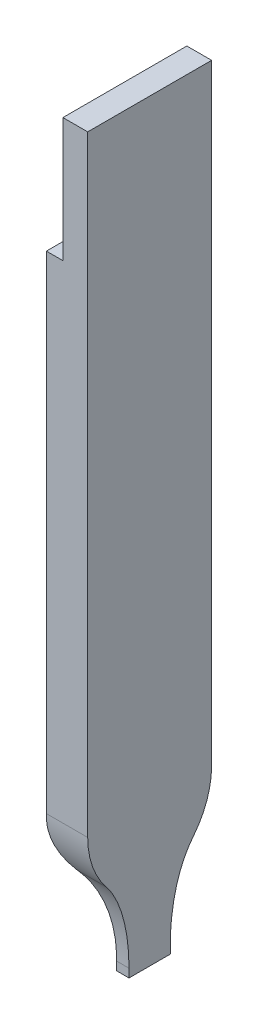
ISO-10303-21;
HEADER;
FILE_DESCRIPTION(('STEP AP214'),'2;1');
FILE_NAME('part.step','',(''),(''),'','','');
FILE_SCHEMA(('AUTOMOTIVE_DESIGN { 1 0 10303 214 1 1 1 1 }'));
ENDSEC;
DATA;
#1=APPLICATION_CONTEXT('core data for automotive mechanical design processes');
#2=APPLICATION_PROTOCOL_DEFINITION('international standard','automotive_design',2000,#1);
#3=PRODUCT_CONTEXT('',#1,'mechanical');
#4=PRODUCT('Part','Part','',(#3));
#5=PRODUCT_RELATED_PRODUCT_CATEGORY('part','',(#4));
#6=PRODUCT_DEFINITION_FORMATION('','',#4);
#7=PRODUCT_DEFINITION_CONTEXT('part definition',#1,'design');
#8=PRODUCT_DEFINITION('design','',#6,#7);
#9=PRODUCT_DEFINITION_SHAPE('','',#8);
#10=(LENGTH_UNIT() NAMED_UNIT(*) SI_UNIT(.MILLI.,.METRE.));
#11=(NAMED_UNIT(*) PLANE_ANGLE_UNIT() SI_UNIT($,.RADIAN.));
#12=(NAMED_UNIT(*) SI_UNIT($,.STERADIAN.) SOLID_ANGLE_UNIT());
#13=UNCERTAINTY_MEASURE_WITH_UNIT(LENGTH_MEASURE(1.E-05),#10,'distance_accuracy_value','');
#14=(GEOMETRIC_REPRESENTATION_CONTEXT(3) GLOBAL_UNCERTAINTY_ASSIGNED_CONTEXT((#13)) GLOBAL_UNIT_ASSIGNED_CONTEXT((#10,
#11,#12)) REPRESENTATION_CONTEXT('',''));
#15=CARTESIAN_POINT('',(0.,0.,0.));
#16=DIRECTION('',(0.,0.,1.));
#17=DIRECTION('',(1.,0.,0.));
#18=AXIS2_PLACEMENT_3D('',#15,#16,#17);
#19=CARTESIAN_POINT('',(-1.79362745098041,0.,15.));
#20=DIRECTION('',(1.,0.,0.));
#21=DIRECTION('',(0.,1.,0.));
#22=AXIS2_PLACEMENT_3D('',#19,#20,#21);
#23=PLANE('',#22);
#24=CARTESIAN_POINT('',(-1.79362745098041,-29.2048639705882,0.));
#25=CARTESIAN_POINT('',(-1.79362745098041,-31.3463143367082,4.99999999999999));
#26=CARTESIAN_POINT('',(-1.79362745098041,-40.879194786528,5.));
#27=(BOUNDED_CURVE() B_SPLINE_CURVE(2,(#24,#25,#26),.UNSPECIFIED.,.F.,
.F.) B_SPLINE_CURVE_WITH_KNOTS((3,3),(0.,1.),
.UNSPECIFIED.) CURVE() GEOMETRIC_REPRESENTATION_ITEM() RATIONAL_B_SPLINE_CURVE((1.,
0.834775654712563,1.)) REPRESENTATION_ITEM(''));
#28=CARTESIAN_POINT('',(-1.7936274509804,-40.879194786528,5.));
#29=VERTEX_POINT('',#28);
#30=CARTESIAN_POINT('',(-1.79362745098041,-30.965964483234,2.22997638980707));
#31=VERTEX_POINT('',#30);
#32=EDGE_CURVE('E267',#29,#31,#27,.F.);
#33=ORIENTED_EDGE('',*,*,#32,.T.);
#34=CARTESIAN_POINT('',(-1.7936274509804,-24.6712958071766,10.));
#35=DIRECTION('',(1.,0.,0.));
#36=DIRECTION('',(0.,1.,0.));
#37=AXIS2_PLACEMENT_3D('',#34,#35,#36);
#38=CIRCLE('',#37,10.);
#39=CARTESIAN_POINT('',(-1.79362745098041,-24.6712958071766,0.));
#40=VERTEX_POINT('',#39);
#41=EDGE_CURVE('E519',#31,#40,#38,.T.);
#42=ORIENTED_EDGE('',*,*,#41,.T.);
#43=DIRECTION('',(0.,-1.,0.));
#44=VECTOR('',#43,1.);
#45=CARTESIAN_POINT('',(-1.79362745098041,0.,0.));
#46=LINE('',#45,#44);
#47=CARTESIAN_POINT('',(-1.79362745098041,49.2951360294117,0.));
#48=VERTEX_POINT('',#47);
#49=EDGE_CURVE('E427',#48,#40,#46,.T.);
#50=ORIENTED_EDGE('',*,*,#49,.F.);
#51=DIRECTION('',(0.,0.,-1.));
#52=VECTOR('',#51,1.);
#53=CARTESIAN_POINT('',(-1.79362745098041,49.2951360294117,15.));
#54=LINE('',#53,#52);
#55=CARTESIAN_POINT('',(-1.79362745098041,49.2951360294117,15.));
#56=VERTEX_POINT('',#55);
#57=EDGE_CURVE('E223',#56,#48,#54,.T.);
#58=ORIENTED_EDGE('',*,*,#57,.F.);
#59=DIRECTION('',(0.,-1.,0.));
#60=VECTOR('',#59,1.);
#61=CARTESIAN_POINT('',(-1.79362745098041,0.,15.));
#62=LINE('',#61,#60);
#63=CARTESIAN_POINT('',(-1.79362745098041,-24.6712958071766,15.));
#64=VERTEX_POINT('',#63);
#65=EDGE_CURVE('E408',#56,#64,#62,.T.);
#66=ORIENTED_EDGE('',*,*,#65,.T.);
#67=CARTESIAN_POINT('',(-1.7936274509804,-24.6712958071766,5.));
#68=DIRECTION('',(1.,0.,0.));
#69=DIRECTION('',(0.,1.,0.));
#70=AXIS2_PLACEMENT_3D('',#67,#68,#69);
#71=CIRCLE('',#70,10.);
#72=CARTESIAN_POINT('',(-1.79362745098041,-30.9659731292309,12.7700347947671));
#73=VERTEX_POINT('',#72);
#74=EDGE_CURVE('E393',#64,#73,#71,.T.);
#75=ORIENTED_EDGE('',*,*,#74,.T.);
#76=CARTESIAN_POINT('',(-1.7936274509804,-40.879194786528,10.));
#77=CARTESIAN_POINT('',(-1.79362745098041,-31.3463143367082,10.));
#78=CARTESIAN_POINT('',(-1.79362745098041,-29.2048639705883,15.));
#79=(BOUNDED_CURVE() B_SPLINE_CURVE(2,(#76,#77,#78),.UNSPECIFIED.,.F.,
.F.) B_SPLINE_CURVE_WITH_KNOTS((3,3),(0.,1.),
.UNSPECIFIED.) CURVE() GEOMETRIC_REPRESENTATION_ITEM() RATIONAL_B_SPLINE_CURVE((1.,
0.834775654712562,1.)) REPRESENTATION_ITEM(''));
#80=CARTESIAN_POINT('',(-1.7936274509804,-40.879194786528,10.));
#81=VERTEX_POINT('',#80);
#82=EDGE_CURVE('E179',#73,#81,#79,.F.);
#83=ORIENTED_EDGE('',*,*,#82,.T.);
#84=DIRECTION('',(0.,-1.,0.));
#85=VECTOR('',#84,1.);
#86=CARTESIAN_POINT('',(-1.79362745098041,0.,10.));
#87=LINE('',#86,#85);
#88=CARTESIAN_POINT('',(-1.7936274509804,-41.9048639705883,10.));
#89=VERTEX_POINT('',#88);
#90=EDGE_CURVE('E172',#81,#89,#87,.T.);
#91=ORIENTED_EDGE('',*,*,#90,.T.);
#92=DIRECTION('',(0.,0.,-1.));
#93=VECTOR('',#92,1.);
#94=CARTESIAN_POINT('',(-1.7936274509804,-41.9048639705883,15.));
#95=LINE('',#94,#93);
#96=CARTESIAN_POINT('',(-1.7936274509804,-41.9048639705883,5.));
#97=VERTEX_POINT('',#96);
#98=EDGE_CURVE('E177',#89,#97,#95,.T.);
#99=ORIENTED_EDGE('',*,*,#98,.T.);
#100=DIRECTION('',(0.,-1.,0.));
#101=VECTOR('',#100,1.);
#102=CARTESIAN_POINT('',(-1.79362745098041,0.,5.));
#103=LINE('',#102,#101);
#104=EDGE_CURVE('E487',#29,#97,#103,.T.);
#105=ORIENTED_EDGE('',*,*,#104,.F.);
#106=EDGE_LOOP('',(#33,#42,#50,#58,#66,#75,#83,#91,#99,#105));
#107=FACE_BOUND('',#106,.T.);
#108=ADVANCED_FACE('F49',(#107),#23,.T.);
#109=CARTESIAN_POINT('',(-3.2936274509804,0.,15.));
#110=DIRECTION('',(1.,0.,0.));
#111=DIRECTION('',(0.,0.,-1.));
#112=AXIS2_PLACEMENT_3D('',#109,#110,#111);
#113=PLANE('',#112);
#114=DIRECTION('',(0.,-1.,0.));
#115=VECTOR('',#114,1.);
#116=CARTESIAN_POINT('',(-3.2936274509804,0.,10.));
#117=LINE('',#116,#115);
#118=CARTESIAN_POINT('',(-3.2936274509804,-40.879194786528,10.));
#119=VERTEX_POINT('',#118);
#120=CARTESIAN_POINT('',(-3.2936274509804,-41.9048639705883,10.));
#121=VERTEX_POINT('',#120);
#122=EDGE_CURVE('E190',#119,#121,#117,.T.);
#123=ORIENTED_EDGE('',*,*,#122,.F.);
#124=CARTESIAN_POINT('',(-3.2936274509804,-29.2048639705883,15.));
#125=CARTESIAN_POINT('',(-3.2936274509804,-31.3463143367082,10.));
#126=CARTESIAN_POINT('',(-3.2936274509804,-40.879194786528,10.));
#127=(BOUNDED_CURVE() B_SPLINE_CURVE(2,(#124,#125,#126),.UNSPECIFIED.,.F.,
.F.) B_SPLINE_CURVE_WITH_KNOTS((3,3),(0.,1.),
.UNSPECIFIED.) CURVE() GEOMETRIC_REPRESENTATION_ITEM() RATIONAL_B_SPLINE_CURVE((1.,
0.834775654712562,1.)) REPRESENTATION_ITEM(''));
#128=CARTESIAN_POINT('',(-3.2936274509804,-40.1154093281769,10.0062287084055));
#129=VERTEX_POINT('',#128);
#130=EDGE_CURVE('E642',#119,#129,#127,.F.);
#131=ORIENTED_EDGE('',*,*,#130,.T.);
#132=CARTESIAN_POINT('',(-3.2936274509804,-40.1154093281769,-0.750000000000001));
#133=CARTESIAN_POINT('',(-3.2936274509804,-40.1154093281769,4.75));
#134=CARTESIAN_POINT('',(-3.2936274509804,-40.1154093281769,10.25));
#135=CARTESIAN_POINT('',(-3.2936274509804,-40.1154093281769,15.75));
#136=(BOUNDED_CURVE() B_SPLINE_CURVE(3,(#132,#133,#134,#135),.UNSPECIFIED.,.F.,
.F.) B_SPLINE_CURVE_WITH_KNOTS((4,4),(-0.01575,0.00075),
.UNSPECIFIED.) CURVE() GEOMETRIC_REPRESENTATION_ITEM() RATIONAL_B_SPLINE_CURVE((1.,1.,1.,1.)) REPRESENTATION_ITEM(''));
#137=CARTESIAN_POINT('',(-3.2936274509804,-40.1154093281769,4.99418169439636));
#138=VERTEX_POINT('',#137);
#139=EDGE_CURVE('E226',#129,#138,#136,.F.);
#140=ORIENTED_EDGE('',*,*,#139,.T.);
#141=CARTESIAN_POINT('',(-3.2936274509804,-40.879194786528,5.));
#142=CARTESIAN_POINT('',(-3.2936274509804,-31.3463143367082,4.99999999999999));
#143=CARTESIAN_POINT('',(-3.2936274509804,-29.2048639705882,0.));
#144=(BOUNDED_CURVE() B_SPLINE_CURVE(2,(#141,#142,#143),.UNSPECIFIED.,.F.,
.F.) B_SPLINE_CURVE_WITH_KNOTS((3,3),(0.,1.),
.UNSPECIFIED.) CURVE() GEOMETRIC_REPRESENTATION_ITEM() RATIONAL_B_SPLINE_CURVE((1.,
0.834775654712563,1.)) REPRESENTATION_ITEM(''));
#145=CARTESIAN_POINT('',(-3.2936274509804,-40.879194786528,5.));
#146=VERTEX_POINT('',#145);
#147=EDGE_CURVE('E637',#138,#146,#144,.F.);
#148=ORIENTED_EDGE('',*,*,#147,.T.);
#149=DIRECTION('',(0.,-1.,0.));
#150=VECTOR('',#149,1.);
#151=CARTESIAN_POINT('',(-3.2936274509804,0.,5.));
#152=LINE('',#151,#150);
#153=CARTESIAN_POINT('',(-3.2936274509804,-41.9048639705883,5.));
#154=VERTEX_POINT('',#153);
#155=EDGE_CURVE('E195',#146,#154,#152,.T.);
#156=ORIENTED_EDGE('',*,*,#155,.T.);
#157=DIRECTION('',(0.,0.,-1.));
#158=VECTOR('',#157,1.);
#159=CARTESIAN_POINT('',(-3.2936274509804,-41.9048639705883,15.));
#160=LINE('',#159,#158);
#161=EDGE_CURVE('E201',#121,#154,#160,.T.);
#162=ORIENTED_EDGE('',*,*,#161,.F.);
#163=EDGE_LOOP('',(#123,#131,#140,#148,#156,#162));
#164=FACE_BOUND('',#163,.T.);
#165=ADVANCED_FACE('F235',(#164),#113,.F.);
#166=CARTESIAN_POINT('',(0.,-41.9048639705883,15.));
#167=DIRECTION('',(0.,-1.,0.));
#168=DIRECTION('',(0.,0.,-1.));
#169=AXIS2_PLACEMENT_3D('',#166,#167,#168);
#170=PLANE('',#169);
#171=ORIENTED_EDGE('',*,*,#98,.F.);
#172=DIRECTION('',(1.,0.,0.));
#173=VECTOR('',#172,1.);
#174=CARTESIAN_POINT('',(-6.8436274509804,-41.9048639705883,10.));
#175=LINE('',#174,#173);
#176=EDGE_CURVE('E184',#121,#89,#175,.T.);
#177=ORIENTED_EDGE('',*,*,#176,.F.);
#178=ORIENTED_EDGE('',*,*,#161,.T.);
#179=DIRECTION('',(1.,0.,0.));
#180=VECTOR('',#179,1.);
#181=CARTESIAN_POINT('',(-6.8436274509804,-41.9048639705883,5.));
#182=LINE('',#181,#180);
#183=EDGE_CURVE('E185',#154,#97,#182,.T.);
#184=ORIENTED_EDGE('',*,*,#183,.T.);
#185=EDGE_LOOP('',(#171,#177,#178,#184));
#186=FACE_BOUND('',#185,.T.);
#187=ADVANCED_FACE('F198',(#186),#170,.T.);
#188=CARTESIAN_POINT('',(0.,0.,15.));
#189=DIRECTION('',(0.,0.,1.));
#190=DIRECTION('',(1.,0.,0.));
#191=AXIS2_PLACEMENT_3D('',#188,#189,#190);
#192=PLANE('',#191);
#193=DIRECTION('',(0.,-1.,0.));
#194=VECTOR('',#193,1.);
#195=CARTESIAN_POINT('',(-6.7936274509804,0.,15.));
#196=LINE('',#195,#194);
#197=CARTESIAN_POINT('',(-6.79362745098041,34.2951360294117,15.));
#198=VERTEX_POINT('',#197);
#199=CARTESIAN_POINT('',(-6.7936274509804,-24.6712958071766,15.));
#200=VERTEX_POINT('',#199);
#201=EDGE_CURVE('E202',#198,#200,#196,.T.);
#202=ORIENTED_EDGE('',*,*,#201,.T.);
#203=DIRECTION('',(1.,0.,0.));
#204=VECTOR('',#203,1.);
#205=CARTESIAN_POINT('',(-1.7936274509804,-24.6712958071766,15.));
#206=LINE('',#205,#204);
#207=EDGE_CURVE('E62',#200,#64,#206,.T.);
#208=ORIENTED_EDGE('',*,*,#207,.T.);
#209=ORIENTED_EDGE('',*,*,#65,.F.);
#210=DIRECTION('',(1.,0.,0.));
#211=VECTOR('',#210,1.);
#212=CARTESIAN_POINT('',(0.,49.2951360294117,15.));
#213=LINE('',#212,#211);
#214=CARTESIAN_POINT('',(-4.79362745098041,49.2951360294117,15.));
#215=VERTEX_POINT('',#214);
#216=EDGE_CURVE('E456',#215,#56,#213,.T.);
#217=ORIENTED_EDGE('',*,*,#216,.F.);
#218=DIRECTION('',(0.,-1.,0.));
#219=VECTOR('',#218,1.);
#220=CARTESIAN_POINT('',(-4.7936274509804,0.,15.));
#221=LINE('',#220,#219);
#222=CARTESIAN_POINT('',(-4.79362745098041,34.2951360294117,15.));
#223=VERTEX_POINT('',#222);
#224=EDGE_CURVE('E473',#215,#223,#221,.T.);
#225=ORIENTED_EDGE('',*,*,#224,.T.);
#226=DIRECTION('',(1.,0.,0.));
#227=VECTOR('',#226,1.);
#228=CARTESIAN_POINT('',(0.,34.2951360294117,15.));
#229=LINE('',#228,#227);
#230=EDGE_CURVE('E209',#198,#223,#229,.T.);
#231=ORIENTED_EDGE('',*,*,#230,.F.);
#232=EDGE_LOOP('',(#202,#208,#209,#217,#225,#231));
#233=FACE_BOUND('',#232,.T.);
#234=ADVANCED_FACE('F505',(#233),#192,.T.);
#235=CARTESIAN_POINT('',(0.,0.,0.));
#236=DIRECTION('',(0.,0.,1.));
#237=DIRECTION('',(1.,0.,0.));
#238=AXIS2_PLACEMENT_3D('',#235,#236,#237);
#239=PLANE('',#238);
#240=ORIENTED_EDGE('',*,*,#49,.T.);
#241=DIRECTION('',(1.,0.,0.));
#242=VECTOR('',#241,1.);
#243=CARTESIAN_POINT('',(0.,-24.6712958071766,0.));
#244=LINE('',#243,#242);
#245=CARTESIAN_POINT('',(-6.7936274509804,-24.6712958071766,0.));
#246=VERTEX_POINT('',#245);
#247=EDGE_CURVE('E515',#40,#246,#244,.F.);
#248=ORIENTED_EDGE('',*,*,#247,.T.);
#249=DIRECTION('',(0.,-1.,0.));
#250=VECTOR('',#249,1.);
#251=CARTESIAN_POINT('',(-6.7936274509804,0.,0.));
#252=LINE('',#251,#250);
#253=CARTESIAN_POINT('',(-6.79362745098041,34.2951360294117,0.));
#254=VERTEX_POINT('',#253);
#255=EDGE_CURVE('E441',#254,#246,#252,.T.);
#256=ORIENTED_EDGE('',*,*,#255,.F.);
#257=DIRECTION('',(1.,0.,0.));
#258=VECTOR('',#257,1.);
#259=CARTESIAN_POINT('',(0.,34.2951360294117,0.));
#260=LINE('',#259,#258);
#261=CARTESIAN_POINT('',(-4.79362745098041,34.2951360294117,0.));
#262=VERTEX_POINT('',#261);
#263=EDGE_CURVE('E212',#254,#262,#260,.T.);
#264=ORIENTED_EDGE('',*,*,#263,.T.);
#265=DIRECTION('',(0.,-1.,0.));
#266=VECTOR('',#265,1.);
#267=CARTESIAN_POINT('',(-4.7936274509804,0.,0.));
#268=LINE('',#267,#266);
#269=CARTESIAN_POINT('',(-4.79362745098041,49.2951360294117,0.));
#270=VERTEX_POINT('',#269);
#271=EDGE_CURVE('E458',#270,#262,#268,.T.);
#272=ORIENTED_EDGE('',*,*,#271,.F.);
#273=DIRECTION('',(1.,0.,0.));
#274=VECTOR('',#273,1.);
#275=CARTESIAN_POINT('',(0.,49.2951360294117,0.));
#276=LINE('',#275,#274);
#277=EDGE_CURVE('E436',#270,#48,#276,.T.);
#278=ORIENTED_EDGE('',*,*,#277,.T.);
#279=EDGE_LOOP('',(#240,#248,#256,#264,#272,#278));
#280=FACE_BOUND('',#279,.T.);
#281=ADVANCED_FACE('F507',(#280),#239,.F.);
#282=CARTESIAN_POINT('',(-6.7936274509804,-29.2048639705882,-0.750000000000001));
#283=CARTESIAN_POINT('',(-6.7936274509804,-29.2048639705882,4.75));
#284=CARTESIAN_POINT('',(-6.7936274509804,-29.2048639705882,10.25));
#285=CARTESIAN_POINT('',(-6.7936274509804,-29.2048639705882,15.75));
#286=CARTESIAN_POINT('',(-3.2936274509804,-31.2900026372981,-0.750000000000001));
#287=CARTESIAN_POINT('',(-3.2936274509804,-31.2900026372981,4.75));
#288=CARTESIAN_POINT('',(-3.2936274509804,-31.2900026372981,10.25));
#289=CARTESIAN_POINT('',(-3.2936274509804,-31.2900026372981,15.75));
#290=CARTESIAN_POINT('',(-3.2936274509804,-40.1154093281769,-0.750000000000001));
#291=CARTESIAN_POINT('',(-3.2936274509804,-40.1154093281769,4.75));
#292=CARTESIAN_POINT('',(-3.2936274509804,-40.1154093281769,10.25));
#293=CARTESIAN_POINT('',(-3.2936274509804,-40.1154093281769,15.75));
#294=(BOUNDED_SURFACE() B_SPLINE_SURFACE(2,3,((#282,#283,#284,#285),(#286,#287,#288,#289),(#290,
#291,#292,#293)),.UNSPECIFIED.,.F.,.F.,.F.) B_SPLINE_SURFACE_WITH_KNOTS((3,3),(4,4),(0.,1.),
(-0.01575,0.00075),
.UNSPECIFIED.) GEOMETRIC_REPRESENTATION_ITEM() RATIONAL_B_SPLINE_SURFACE(((1.,1.,1.,1.),
(0.869428267202662,0.869428267202662,0.869428267202662,0.869428267202662),(1.,1.,1.,1.))) REPRESENTATION_ITEM('') SURFACE());
#295=DIRECTION('',(0.,0.,1.));
#296=VECTOR('',#295,1.);
#297=CARTESIAN_POINT('',(-5.25960667549883,-30.7974273002108,5.));
#298=LINE('',#297,#296);
#299=CARTESIAN_POINT('',(-5.25960667549883,-30.7974273002108,5.));
#300=VERTEX_POINT('',#299);
#301=CARTESIAN_POINT('',(-5.25874423345095,-30.7988353268323,2.09049053590628));
#302=VERTEX_POINT('',#301);
#303=EDGE_CURVE('E547',#300,#302,#298,.F.);
#304=CARTESIAN_POINT('',(-5.25960667549874,-30.7974273002109,2.09617099564672));
#305=CARTESIAN_POINT('',(-5.2552727326029,-30.8043210989193,2.10174555718311));
#306=CARTESIAN_POINT('',(-5.25094851430394,-30.811225578271,2.10731446977907));
#307=CARTESIAN_POINT('',(-5.24231073802998,-30.8250697171454,2.1184523177639));
#308=CARTESIAN_POINT('',(-5.23799721943302,-30.8320094196102,2.12402123031579));
#309=CARTESIAN_POINT('',(-5.22938089831693,-30.845923964537,2.13515907814187));
#310=CARTESIAN_POINT('',(-5.22507813525477,-30.8528988497175,2.14072799057104));
#311=CARTESIAN_POINT('',(-5.21648338063061,-30.8668837195643,2.15186583818032));
#312=CARTESIAN_POINT('',(-5.21219142860049,-30.8738937467239,2.1574347505101));
#313=CARTESIAN_POINT('',(-5.20361835135707,-30.8879488590961,2.16857259791793));
#314=CARTESIAN_POINT('',(-5.19933726574696,-30.8949939865742,2.17414151014278));
#315=CARTESIAN_POINT('',(-5.19078597647852,-30.9091192574249,2.18527935734875));
#316=CARTESIAN_POINT('',(-5.18651581249097,-30.9161994428335,2.19084826947628));
#317=CARTESIAN_POINT('',(-5.17798642148535,-30.9303947864617,2.20198611646951));
#318=CARTESIAN_POINT('',(-5.17372723420209,-30.9375099864854,2.20755502848366));
#319=CARTESIAN_POINT('',(-5.16521985131013,-30.95177531594,2.21869287531121));
#320=CARTESIAN_POINT('',(-5.16097169549633,-30.9589254869417,2.22426178727774));
#321=CARTESIAN_POINT('',(-5.15673335908623,-30.9660858418714,2.22982507152444));
#322=B_SPLINE_CURVE_WITH_KNOTS('',3,(#304,#305,#306,#307,#308,#309,#310,#311,#312,#313,#314,
#315,#316,#317,#318,#319,#320,#321),.UNSPECIFIED.,.F.,.F.,(4,2,2,2,2,2,2,2,4),(0.,
0.0296048737193099,0.0592697591820098,0.0889947884212876,0.118780090459088,0.148625791300678,
0.178532013929347,0.208498878301569,0.23852650134239),.UNSPECIFIED.);
#323=CARTESIAN_POINT('',(-5.15673366094395,-30.9660856674138,2.22982551967915));
#324=VERTEX_POINT('',#323);
#325=EDGE_CURVE('E569',#302,#324,#322,.T.);
#326=CARTESIAN_POINT('',(-5.15673363789309,-30.9660853708479,2.22982586891108));
#327=CARTESIAN_POINT('',(-5.15382574665126,-30.9709980301561,2.23380538780815));
#328=CARTESIAN_POINT('',(-5.15092164140713,-30.9759169032358,2.23778009520365));
#329=CARTESIAN_POINT('',(-5.09194154920843,-31.076071604092,2.31851082228527));
#330=CARTESIAN_POINT('',(-5.03727835414241,-31.173613200541,2.39347161469943));
#331=CARTESIAN_POINT('',(-4.93070407890917,-31.373119091597,2.53991836515773));
#332=CARTESIAN_POINT('',(-4.87879969674854,-31.4750931467875,2.61139583410468));
#333=CARTESIAN_POINT('',(-4.77652975375163,-31.6856393869418,2.75259512064363));
#334=CARTESIAN_POINT('',(-4.72624222896935,-31.7943150316054,2.82221917475874));
#335=CARTESIAN_POINT('',(-4.62858918950886,-32.0155190832529,2.95783329740895));
#336=CARTESIAN_POINT('',(-4.58122961553917,-32.12805464655,3.02381595033187));
#337=CARTESIAN_POINT('',(-4.48942985366848,-32.3565738035321,3.15214721896442));
#338=CARTESIAN_POINT('',(-4.44499389036251,-32.4725620496687,3.21449056185179));
#339=CARTESIAN_POINT('',(-4.35902619200528,-32.7075810799591,3.33554173607625));
#340=CARTESIAN_POINT('',(-4.31749644856344,-32.8266138756953,3.39424707122276));
#341=CARTESIAN_POINT('',(-4.2366775326181,-33.0692292505767,3.50891812724371));
#342=CARTESIAN_POINT('',(-4.19743355269481,-33.1928538697791,3.56482665168087));
#343=CARTESIAN_POINT('',(-4.12187303121133,-33.4424111319883,3.67289547496938));
#344=CARTESIAN_POINT('',(-4.08555289605222,-33.5683407008531,3.72506036615907));
#345=CARTESIAN_POINT('',(-4.01885881041184,-33.8109298289041,3.82115955550794));
#346=CARTESIAN_POINT('',(-3.9882441631245,-33.9273977520632,3.86541155237688));
#347=CARTESIAN_POINT('',(-3.92894653054356,-34.1632421201054,3.9513980164818));
#348=CARTESIAN_POINT('',(-3.90028782091695,-34.2826363679479,3.99310034337681));
#349=CARTESIAN_POINT('',(-3.84447569114282,-34.5261192132782,4.07465585855164));
#350=CARTESIAN_POINT('',(-3.81738277548342,-34.6502480997199,4.1144301030855));
#351=CARTESIAN_POINT('',(-3.76523552031319,-34.9011294030231,4.19138340227266));
#352=CARTESIAN_POINT('',(-3.74020409106043,-35.0278956315609,4.22853277040073));
#353=CARTESIAN_POINT('',(-3.66786810566832,-35.4135373874844,4.33656619471218));
#354=CARTESIAN_POINT('',(-3.62409443109868,-35.6743675030855,4.40290740390555));
#355=CARTESIAN_POINT('',(-3.54472012149101,-36.2040749027999,4.52529141447213));
#356=CARTESIAN_POINT('',(-3.50926013822749,-36.4730142055102,4.5811541741818));
#357=CARTESIAN_POINT('',(-3.44647690292658,-37.0173477657714,4.68255057126625));
#358=CARTESIAN_POINT('',(-3.41926281130297,-37.2927806196403,4.72794388272606));
#359=CARTESIAN_POINT('',(-3.37286019895332,-37.8484754730017,4.80835989667491));
#360=CARTESIAN_POINT('',(-3.35374949717903,-38.1287585302785,4.84328113873734));
#361=CARTESIAN_POINT('',(-3.32336147728191,-38.6925556823244,4.90272390519147));
#362=CARTESIAN_POINT('',(-3.3121322155409,-38.9760790665022,4.92718128017339));
#363=CARTESIAN_POINT('',(-3.2972589241011,-39.5448236788608,4.96563066585281));
#364=CARTESIAN_POINT('',(-3.29363593007166,-39.8300474335808,4.97959358519975));
#365=CARTESIAN_POINT('',(-3.2936274509804,-40.1154093281769,4.98836338879271));
#366=B_SPLINE_CURVE_WITH_KNOTS('',3,(#326,#327,#328,#329,#330,#331,#332,#333,#334,#335,#336,
#337,#338,#339,#340,#341,#342,#343,#344,#345,#346,#347,#348,#349,#350,#351,#352,#353,#354,#355,
#356,#357,#358,#359,#360,#361,#362,#363,#364,#365),.UNSPECIFIED.,.F.,.F.,(4,2,2,2,2,2,2,2,2,2,2,
2,2,2,2,2,2,2,2,4),(0.,0.0208769235582776,0.424547792004421,0.829157712263032,1.24456578023039,
1.66079076249486,2.07760454487685,2.49470122453831,2.91832029189942,3.34141049125386,
3.72623678279609,4.11519585472088,4.5145251053609,4.91781902944442,5.73535128194707,
6.56585101144719,7.40690769812876,8.25586775109909,9.10996031857385,9.96641184442277),.UNSPECIFIED.);
#367=EDGE_CURVE('E386',#324,#138,#366,.T.);
#368=CARTESIAN_POINT('',(-3.2936274509804,-40.1154093281769,10.0116366112073));
#369=CARTESIAN_POINT('',(-3.29363582497089,-39.8309089479313,10.0203797014481));
#370=CARTESIAN_POINT('',(-3.29723702329402,-39.5465459886203,10.0342840314172));
#371=CARTESIAN_POINT('',(-3.31201947767211,-38.9795140322157,10.0725510569729));
#372=CARTESIAN_POINT('',(-3.32317980217632,-38.6968425262265,10.096884804898));
#373=CARTESIAN_POINT('',(-3.35337969907775,-38.134725686973,10.15601508035));
#374=CARTESIAN_POINT('',(-3.37237165535091,-37.8552711715975,10.1907480372355));
#375=CARTESIAN_POINT('',(-3.41848414400931,-37.3011944673029,10.2707216722263));
#376=CARTESIAN_POINT('',(-3.44552767653205,-37.0265514977105,10.3158619381076));
#377=CARTESIAN_POINT('',(-3.50791578207416,-36.4837428144889,10.4166859542842));
#378=CARTESIAN_POINT('',(-3.54315241219926,-36.2155390461534,10.4722309172294));
#379=CARTESIAN_POINT('',(-3.62202557657825,-35.687232281043,10.593912448692));
#380=CARTESIAN_POINT('',(-3.66552306415346,-35.427068167305,10.6598710063605));
#381=CARTESIAN_POINT('',(-3.73740103773274,-35.042373146571,10.7672746188781));
#382=CARTESIAN_POINT('',(-3.76227464391375,-34.9159078689188,10.8042077405594));
#383=CARTESIAN_POINT('',(-3.81409332019682,-34.6656053619251,10.8807121388854));
#384=CARTESIAN_POINT('',(-3.84101573749399,-34.5417545255856,10.9202540623802));
#385=CARTESIAN_POINT('',(-3.89682184402312,-34.2972884061647,11.0018351346477));
#386=CARTESIAN_POINT('',(-3.92567372565562,-34.1766520350645,11.0438328022334));
#387=CARTESIAN_POINT('',(-3.98539582790223,-33.9383754918701,11.1304626486998));
#388=CARTESIAN_POINT('',(-4.01624109837959,-33.8207170641829,11.1750617620886));
#389=CARTESIAN_POINT('',(-4.08277698616882,-33.5781708333666,11.2709447931869));
#390=CARTESIAN_POINT('',(-4.11865787413501,-33.453433828997,11.3224788122184));
#391=CARTESIAN_POINT('',(-4.19322211808569,-33.2063974675881,11.4291073708132));
#392=CARTESIAN_POINT('',(-4.23190446087023,-33.0840972494427,11.4842006223412));
#393=CARTESIAN_POINT('',(-4.31197063924135,-32.8427326678416,11.5977754393645));
#394=CARTESIAN_POINT('',(-4.3533410650078,-32.7236558942378,11.6562400433311));
#395=CARTESIAN_POINT('',(-4.43892196963252,-32.4886977717491,11.776726724833));
#396=CARTESIAN_POINT('',(-4.48312642306224,-32.3728103461788,11.8387412266802));
#397=CARTESIAN_POINT('',(-4.58327125538279,-32.1224023945247,11.9787381939681));
#398=CARTESIAN_POINT('',(-4.63983730196665,-31.9885668778304,12.0575032863494));
#399=CARTESIAN_POINT('',(-4.75703028162655,-31.7266873408305,12.2201715318566));
#400=CARTESIAN_POINT('',(-4.81764085691222,-31.5986231290101,12.3040538829632));
#401=CARTESIAN_POINT('',(-4.92457140536531,-31.3854447687537,12.4514492190472));
#402=CARTESIAN_POINT('',(-4.96979960718837,-31.2988551362199,12.5136267255835));
#403=CARTESIAN_POINT('',(-5.06199497743831,-31.1295539265888,12.6399776864212));
#404=CARTESIAN_POINT('',(-5.10894248103963,-31.046814144595,12.7041277128465));
#405=CARTESIAN_POINT('',(-5.15696247320494,-30.9656987966354,12.7695223034722));
#406=B_SPLINE_CURVE_WITH_KNOTS('',3,(#368,#369,#370,#371,#372,#373,#374,#375,#376,#377,#378,
#379,#380,#381,#382,#383,#384,#385,#386,#387,#388,#389,#390,#391,#392,#393,#394,#395,#396,#397,
#398,#399,#400,#401,#402,#403,#404,#405),.UNSPECIFIED.,.F.,.F.,(4,2,2,2,2,2,2,2,2,2,2,2,2,2,2,2,
2,2,4),(0.,0.853865988660042,1.7053771993175,2.55178583922544,3.39034668136103,4.21842977853639,
5.03364421858867,5.43582027168094,5.83406072136999,6.22686223726152,6.61545322914088,
7.0343143226288,7.45302467628628,7.86978645807788,8.28568979924572,8.78129343658475,
9.2750016874768,9.62231352104697,9.96645196345382),.UNSPECIFIED.);
#407=CARTESIAN_POINT('',(-5.15684555991683,-30.9658933274204,12.7698477992357));
#408=VERTEX_POINT('',#407);
#409=EDGE_CURVE('E394',#129,#408,#406,.T.);
#410=CARTESIAN_POINT('',(-5.15673267520269,-30.9660869972421,12.7701739924842));
#411=CARTESIAN_POINT('',(-5.160971039456,-30.9589265923934,12.7757373156543));
#412=CARTESIAN_POINT('',(-5.16521922324486,-30.9517763716075,12.7813062666203));
#413=CARTESIAN_POINT('',(-5.17372666223849,-30.9375109430529,12.7924441914473));
#414=CARTESIAN_POINT('',(-5.17798587764757,-30.9303956937127,12.7980131424609));
#415=CARTESIAN_POINT('',(-5.18651532505528,-30.9162002519208,12.8091510674536));
#416=CARTESIAN_POINT('',(-5.19078551731831,-30.9091200176643,12.8147200185806));
#417=CARTESIAN_POINT('',(-5.19933686328706,-30.894994649588,12.825857943786));
#418=CARTESIAN_POINT('',(-5.20361797732122,-30.8879494737314,12.8314268950103));
#419=CARTESIAN_POINT('',(-5.21219111156097,-30.8738942650736,12.8425648204176));
#420=CARTESIAN_POINT('',(-5.21648309216259,-30.8668841900058,12.8481337717468));
#421=CARTESIAN_POINT('',(-5.22507790407687,-30.8528992248149,12.8592716973556));
#422=CARTESIAN_POINT('',(-5.22938069585688,-30.8459242921975,12.8648406487842));
#423=CARTESIAN_POINT('',(-5.23799707455467,-30.8320096528699,12.8759785746097));
#424=CARTESIAN_POINT('',(-5.24231062201468,-30.8250699034402,12.8815475261611));
#425=CARTESIAN_POINT('',(-5.25094845615966,-30.81122567111,12.8926854521454));
#426=CARTESIAN_POINT('',(-5.25527270346578,-30.8043211452664,12.8982544037409));
#427=CARTESIAN_POINT('',(-5.25960667549875,-30.7974273002109,12.9038290043533));
#428=B_SPLINE_CURVE_WITH_KNOTS('',3,(#410,#411,#412,#413,#414,#415,#416,#417,#418,#419,#420,
#421,#422,#423,#424,#425,#426,#427),.UNSPECIFIED.,.F.,.F.,(4,2,2,2,2,2,2,2,4),(0.,
0.0300278304463745,0.0599949014079689,0.0899013298120719,0.119747235617465,0.149532741809844,
0.179257974396934,0.208923062403262,0.238528137864636),.UNSPECIFIED.);
#429=CARTESIAN_POINT('',(-5.25860347345265,-30.798784187898,12.9088325183828));
#430=VERTEX_POINT('',#429);
#431=EDGE_CURVE('E552',#408,#430,#428,.T.);
#432=DIRECTION('',(0.,0.,1.));
#433=VECTOR('',#432,1.);
#434=CARTESIAN_POINT('',(-5.25960667549883,-30.7974273002108,12.9091871138565));
#435=LINE('',#434,#433);
#436=CARTESIAN_POINT('',(-5.25960667549884,-30.7974273002108,10.));
#437=VERTEX_POINT('',#436);
#438=EDGE_CURVE('E75',#430,#437,#435,.F.);
#439=DIRECTION('',(0.,0.,1.));
#440=VECTOR('',#439,1.);
#441=CARTESIAN_POINT('',(-5.25960667549884,-30.7974273002108,10.));
#442=LINE('',#441,#440);
#443=EDGE_CURVE('E70',#437,#300,#442,.F.);
#444=ORIENTED_EDGE('',*,*,#303,.T.);
#445=ORIENTED_EDGE('',*,*,#325,.T.);
#446=ORIENTED_EDGE('',*,*,#367,.T.);
#447=ORIENTED_EDGE('',*,*,#139,.F.);
#448=ORIENTED_EDGE('',*,*,#409,.T.);
#449=ORIENTED_EDGE('',*,*,#431,.T.);
#450=ORIENTED_EDGE('',*,*,#438,.T.);
#451=ORIENTED_EDGE('',*,*,#443,.T.);
#452=EDGE_LOOP('',(#444,#445,#446,#447,#448,#449,#450,#451));
#453=FACE_BOUND('',#452,.T.);
#454=ADVANCED_FACE('F290',(#453),#294,.T.);
#455=CARTESIAN_POINT('',(0.,49.2951360294117,15.));
#456=DIRECTION('',(0.,1.,0.));
#457=DIRECTION('',(0.,0.,1.));
#458=AXIS2_PLACEMENT_3D('',#455,#456,#457);
#459=PLANE('',#458);
#460=ORIENTED_EDGE('',*,*,#277,.F.);
#461=DIRECTION('',(0.,0.,-1.));
#462=VECTOR('',#461,1.);
#463=CARTESIAN_POINT('',(-4.79362745098041,49.2951360294117,15.));
#464=LINE('',#463,#462);
#465=EDGE_CURVE('E220',#215,#270,#464,.T.);
#466=ORIENTED_EDGE('',*,*,#465,.F.);
#467=ORIENTED_EDGE('',*,*,#216,.T.);
#468=ORIENTED_EDGE('',*,*,#57,.T.);
#469=EDGE_LOOP('',(#460,#466,#467,#468));
#470=FACE_BOUND('',#469,.T.);
#471=ADVANCED_FACE('F418',(#470),#459,.T.);
#472=CARTESIAN_POINT('',(-4.7936274509804,0.,15.));
#473=DIRECTION('',(1.,0.,0.));
#474=DIRECTION('',(0.,1.,0.));
#475=AXIS2_PLACEMENT_3D('',#472,#473,#474);
#476=PLANE('',#475);
#477=ORIENTED_EDGE('',*,*,#271,.T.);
#478=DIRECTION('',(0.,0.,-1.));
#479=VECTOR('',#478,1.);
#480=CARTESIAN_POINT('',(-4.79362745098041,34.2951360294117,15.));
#481=LINE('',#480,#479);
#482=EDGE_CURVE('E217',#223,#262,#481,.T.);
#483=ORIENTED_EDGE('',*,*,#482,.F.);
#484=ORIENTED_EDGE('',*,*,#224,.F.);
#485=ORIENTED_EDGE('',*,*,#465,.T.);
#486=EDGE_LOOP('',(#477,#483,#484,#485));
#487=FACE_BOUND('',#486,.T.);
#488=ADVANCED_FACE('F708',(#487),#476,.F.);
#489=CARTESIAN_POINT('',(0.,34.2951360294117,15.));
#490=DIRECTION('',(0.,1.,0.));
#491=DIRECTION('',(0.,0.,1.));
#492=AXIS2_PLACEMENT_3D('',#489,#490,#491);
#493=PLANE('',#492);
#494=ORIENTED_EDGE('',*,*,#263,.F.);
#495=DIRECTION('',(0.,0.,-1.));
#496=VECTOR('',#495,1.);
#497=CARTESIAN_POINT('',(-6.79362745098041,34.2951360294117,15.));
#498=LINE('',#497,#496);
#499=EDGE_CURVE('E206',#198,#254,#498,.T.);
#500=ORIENTED_EDGE('',*,*,#499,.F.);
#501=ORIENTED_EDGE('',*,*,#230,.T.);
#502=ORIENTED_EDGE('',*,*,#482,.T.);
#503=EDGE_LOOP('',(#494,#500,#501,#502));
#504=FACE_BOUND('',#503,.T.);
#505=ADVANCED_FACE('F712',(#504),#493,.T.);
#506=CARTESIAN_POINT('',(-6.7936274509804,0.,15.));
#507=DIRECTION('',(1.,0.,0.));
#508=DIRECTION('',(0.,1.,0.));
#509=AXIS2_PLACEMENT_3D('',#506,#507,#508);
#510=PLANE('',#509);
#511=ORIENTED_EDGE('',*,*,#255,.T.);
#512=CARTESIAN_POINT('',(-6.7936274509804,-24.6712958071766,10.));
#513=DIRECTION('',(1.,0.,0.));
#514=DIRECTION('',(0.,1.,0.));
#515=AXIS2_PLACEMENT_3D('',#512,#513,#514);
#516=CIRCLE('',#515,10.);
#517=CARTESIAN_POINT('',(-6.7936274509804,-25.475097380897,0.032357197908596));
#518=VERTEX_POINT('',#517);
#519=EDGE_CURVE('E521',#246,#518,#516,.F.);
#520=ORIENTED_EDGE('',*,*,#519,.T.);
#521=DIRECTION('',(0.,0.,1.));
#522=VECTOR('',#521,1.);
#523=CARTESIAN_POINT('',(-6.7936274509804,-25.475097380897,15.));
#524=LINE('',#523,#522);
#525=CARTESIAN_POINT('',(-6.7936274509804,-25.475097380897,5.));
#526=VERTEX_POINT('',#525);
#527=EDGE_CURVE('E535',#518,#526,#524,.T.);
#528=ORIENTED_EDGE('',*,*,#527,.T.);
#529=DIRECTION('',(0.,0.,1.));
#530=VECTOR('',#529,1.);
#531=CARTESIAN_POINT('',(-6.7936274509804,-25.475097380897,15.));
#532=LINE('',#531,#530);
#533=CARTESIAN_POINT('',(-6.7936274509804,-25.4750973808971,10.));
#534=VERTEX_POINT('',#533);
#535=EDGE_CURVE('E523',#526,#534,#532,.T.);
#536=ORIENTED_EDGE('',*,*,#535,.T.);
#537=DIRECTION('',(0.,0.,1.));
#538=VECTOR('',#537,1.);
#539=CARTESIAN_POINT('',(-6.7936274509804,-25.475097380897,15.));
#540=LINE('',#539,#538);
#541=CARTESIAN_POINT('',(-6.7936274509804,-25.475097380897,14.9676428020914));
#542=VERTEX_POINT('',#541);
#543=EDGE_CURVE('E527',#534,#542,#540,.T.);
#544=ORIENTED_EDGE('',*,*,#543,.T.);
#545=CARTESIAN_POINT('',(-6.7936274509804,-24.6712958071766,5.));
#546=DIRECTION('',(1.,0.,0.));
#547=DIRECTION('',(0.,1.,0.));
#548=AXIS2_PLACEMENT_3D('',#545,#546,#547);
#549=CIRCLE('',#548,10.);
#550=EDGE_CURVE('E538',#542,#200,#549,.F.);
#551=ORIENTED_EDGE('',*,*,#550,.T.);
#552=ORIENTED_EDGE('',*,*,#201,.F.);
#553=ORIENTED_EDGE('',*,*,#499,.T.);
#554=EDGE_LOOP('',(#511,#520,#528,#536,#544,#551,#552,#553));
#555=FACE_BOUND('',#554,.T.);
#556=ADVANCED_FACE('F247',(#555),#510,.F.);
#557=CARTESIAN_POINT('',(-6.8436274509804,0.,5.));
#558=DIRECTION('',(0.,0.,1.));
#559=DIRECTION('',(0.,-1.,0.));
#560=AXIS2_PLACEMENT_3D('',#557,#558,#559);
#561=PLANE('',#560);
#562=ORIENTED_EDGE('',*,*,#155,.F.);
#563=CARTESIAN_POINT('',(-1.5436274509804,-40.879194786528,5.));
#564=CARTESIAN_POINT('',(-3.37696078431373,-40.879194786528,5.));
#565=CARTESIAN_POINT('',(-5.21029411764706,-40.879194786528,5.));
#566=CARTESIAN_POINT('',(-7.0436274509804,-40.879194786528,5.));
#567=(BOUNDED_CURVE() B_SPLINE_CURVE(3,(#563,#564,#565,#566),.UNSPECIFIED.,.F.,
.F.) B_SPLINE_CURVE_WITH_KNOTS((4,4),(-0.000199999999999998,0.0053),
.UNSPECIFIED.) CURVE() GEOMETRIC_REPRESENTATION_ITEM() RATIONAL_B_SPLINE_CURVE((1.,1.,1.,1.)) REPRESENTATION_ITEM(''));
#568=EDGE_CURVE('E491',#146,#29,#567,.F.);
#569=ORIENTED_EDGE('',*,*,#568,.T.);
#570=ORIENTED_EDGE('',*,*,#104,.T.);
#571=ORIENTED_EDGE('',*,*,#183,.F.);
#572=EDGE_LOOP('',(#562,#569,#570,#571));
#573=FACE_BOUND('',#572,.T.);
#574=ADVANCED_FACE('F495',(#573),#561,.F.);
#575=CARTESIAN_POINT('',(-6.8436274509804,0.,10.));
#576=DIRECTION('',(0.,0.,1.));
#577=DIRECTION('',(0.,-1.,0.));
#578=AXIS2_PLACEMENT_3D('',#575,#576,#577);
#579=PLANE('',#578);
#580=ORIENTED_EDGE('',*,*,#90,.F.);
#581=CARTESIAN_POINT('',(-7.0436274509804,-40.879194786528,10.));
#582=CARTESIAN_POINT('',(-5.21029411764707,-40.879194786528,10.));
#583=CARTESIAN_POINT('',(-3.37696078431373,-40.879194786528,10.));
#584=CARTESIAN_POINT('',(-1.5436274509804,-40.879194786528,10.));
#585=(BOUNDED_CURVE() B_SPLINE_CURVE(3,(#581,#582,#583,#584),.UNSPECIFIED.,.F.,
.F.) B_SPLINE_CURVE_WITH_KNOTS((4,4),(-0.0053,0.000199999999999998),
.UNSPECIFIED.) CURVE() GEOMETRIC_REPRESENTATION_ITEM() RATIONAL_B_SPLINE_CURVE((1.,1.,1.,1.)) REPRESENTATION_ITEM(''));
#586=EDGE_CURVE('E646',#81,#119,#585,.F.);
#587=ORIENTED_EDGE('',*,*,#586,.T.);
#588=ORIENTED_EDGE('',*,*,#122,.T.);
#589=ORIENTED_EDGE('',*,*,#176,.T.);
#590=EDGE_LOOP('',(#580,#587,#588,#589));
#591=FACE_BOUND('',#590,.T.);
#592=ADVANCED_FACE('F188',(#591),#579,.T.);
#593=CARTESIAN_POINT('',(-7.0436274509804,-40.879194786528,5.));
#594=CARTESIAN_POINT('',(-5.21029411764706,-40.879194786528,5.));
#595=CARTESIAN_POINT('',(-3.37696078431373,-40.879194786528,5.));
#596=CARTESIAN_POINT('',(-1.5436274509804,-40.879194786528,5.));
#597=CARTESIAN_POINT('',(-7.0436274509804,-31.3463143367082,4.99999999999999));
#598=CARTESIAN_POINT('',(-5.21029411764707,-31.3463143367082,4.99999999999999));
#599=CARTESIAN_POINT('',(-3.37696078431373,-31.3463143367082,4.99999999999999));
#600=CARTESIAN_POINT('',(-1.5436274509804,-31.3463143367082,4.99999999999999));
#601=CARTESIAN_POINT('',(-7.0436274509804,-29.2048639705882,0.));
#602=CARTESIAN_POINT('',(-5.21029411764706,-29.2048639705882,0.));
#603=CARTESIAN_POINT('',(-3.37696078431373,-29.2048639705882,0.));
#604=CARTESIAN_POINT('',(-1.5436274509804,-29.2048639705882,0.));
#605=(BOUNDED_SURFACE() B_SPLINE_SURFACE(2,3,((#593,#594,#595,#596),(#597,#598,#599,#600),(#601,
#602,#603,#604)),.UNSPECIFIED.,.F.,.F.,.F.) B_SPLINE_SURFACE_WITH_KNOTS((3,3),(4,4),(0.,1.),
(-0.000199999999999998,0.0053),
.UNSPECIFIED.) GEOMETRIC_REPRESENTATION_ITEM() RATIONAL_B_SPLINE_SURFACE(((1.,1.,1.,1.),
(0.834775654712563,0.834775654712563,0.834775654712563,0.834775654712563),(1.,1.,1.,1.))) REPRESENTATION_ITEM('') SURFACE());
#606=DIRECTION('',(1.,0.,0.));
#607=VECTOR('',#606,1.);
#608=CARTESIAN_POINT('',(-5.15673368692385,-30.9660859590317,2.22982516643878));
#609=LINE('',#608,#607);
#610=EDGE_CURVE('E390',#324,#31,#609,.T.);
#611=ORIENTED_EDGE('',*,*,#367,.F.);
#612=ORIENTED_EDGE('',*,*,#610,.T.);
#613=ORIENTED_EDGE('',*,*,#32,.F.);
#614=ORIENTED_EDGE('',*,*,#568,.F.);
#615=ORIENTED_EDGE('',*,*,#147,.F.);
#616=EDGE_LOOP('',(#611,#612,#613,#614,#615));
#617=FACE_BOUND('',#616,.T.);
#618=ADVANCED_FACE('F275',(#617),#605,.T.);
#619=CARTESIAN_POINT('',(-1.5436274509804,-40.879194786528,10.));
#620=CARTESIAN_POINT('',(-3.37696078431373,-40.879194786528,10.));
#621=CARTESIAN_POINT('',(-5.21029411764707,-40.879194786528,10.));
#622=CARTESIAN_POINT('',(-7.0436274509804,-40.879194786528,10.));
#623=CARTESIAN_POINT('',(-1.5436274509804,-31.3463143367082,10.));
#624=CARTESIAN_POINT('',(-3.37696078431374,-31.3463143367082,10.));
#625=CARTESIAN_POINT('',(-5.21029411764706,-31.3463143367082,10.));
#626=CARTESIAN_POINT('',(-7.0436274509804,-31.3463143367082,10.));
#627=CARTESIAN_POINT('',(-1.5436274509804,-29.2048639705883,15.));
#628=CARTESIAN_POINT('',(-3.37696078431374,-29.2048639705883,15.));
#629=CARTESIAN_POINT('',(-5.21029411764707,-29.2048639705883,15.));
#630=CARTESIAN_POINT('',(-7.0436274509804,-29.2048639705883,15.));
#631=(BOUNDED_SURFACE() B_SPLINE_SURFACE(2,3,((#619,#620,#621,#622),(#623,#624,#625,#626),(#627,
#628,#629,#630)),.UNSPECIFIED.,.F.,.F.,.F.) B_SPLINE_SURFACE_WITH_KNOTS((3,3),(4,4),(0.,1.),
(-0.0053,0.000199999999999998),
.UNSPECIFIED.) GEOMETRIC_REPRESENTATION_ITEM() RATIONAL_B_SPLINE_SURFACE(((1.,1.,1.,1.),
(0.834775654712562,0.834775654712562,0.834775654712562,0.834775654712562),(1.,1.,1.,1.))) REPRESENTATION_ITEM('') SURFACE());
#632=DIRECTION('',(-1.,0.,0.));
#633=VECTOR('',#632,1.);
#634=CARTESIAN_POINT('',(-1.79362745098041,-30.9660859590317,12.7701748335612));
#635=LINE('',#634,#633);
#636=EDGE_CURVE('E12',#73,#408,#635,.T.);
#637=ORIENTED_EDGE('',*,*,#82,.F.);
#638=ORIENTED_EDGE('',*,*,#636,.T.);
#639=ORIENTED_EDGE('',*,*,#409,.F.);
#640=ORIENTED_EDGE('',*,*,#130,.F.);
#641=ORIENTED_EDGE('',*,*,#586,.F.);
#642=EDGE_LOOP('',(#637,#638,#639,#640,#641));
#643=FACE_BOUND('',#642,.T.);
#644=ADVANCED_FACE('F289',(#643),#631,.T.);
#645=CARTESIAN_POINT('',(-4.29362745098041,-24.6712958071766,5.));
#646=DIRECTION('',(-1.,0.,0.));
#647=DIRECTION('',(0.,0.,1.));
#648=AXIS2_PLACEMENT_3D('',#645,#646,#647);
#649=CYLINDRICAL_SURFACE('',#648,10.);
#650=ORIENTED_EDGE('',*,*,#207,.F.);
#651=ORIENTED_EDGE('',*,*,#550,.F.);
#652=CARTESIAN_POINT('',(-5.25960667549883,-30.7974273002108,12.9038290043532));
#653=CARTESIAN_POINT('',(-5.36635424200606,-30.6276401239979,13.0354302880965));
#654=CARTESIAN_POINT('',(-5.46955186209127,-30.4521397522429,13.1626968389525));
#655=CARTESIAN_POINT('',(-5.66762242375279,-30.0897352391994,13.4076396667974));
#656=CARTESIAN_POINT('',(-5.76248501325955,-29.902817392322,13.5253040053247));
#657=CARTESIAN_POINT('',(-5.9431030114231,-29.5164982004961,13.7506803892327));
#658=CARTESIAN_POINT('',(-6.02878057881798,-29.3170099246771,13.8583064968441));
#659=CARTESIAN_POINT('',(-6.18865647823148,-28.9075448018259,14.061256313186));
#660=CARTESIAN_POINT('',(-6.26286038761478,-28.6975731168812,14.1565859954698));
#661=CARTESIAN_POINT('',(-6.39013326708696,-28.2940080470836,14.322963530169));
#662=CARTESIAN_POINT('',(-6.44467385414444,-28.1015148149173,14.3955540290933));
#663=CARTESIAN_POINT('',(-6.54279628773619,-27.7099193620845,14.529405043693));
#664=CARTESIAN_POINT('',(-6.58638009523836,-27.5108183312665,14.5906675862471));
#665=CARTESIAN_POINT('',(-6.66152718399188,-27.1079931883991,14.7008202868567));
#666=CARTESIAN_POINT('',(-6.69314385976806,-26.9042940139771,14.7497650678625));
#667=CARTESIAN_POINT('',(-6.74386280936211,-26.4928079454276,14.8349469778657));
#668=CARTESIAN_POINT('',(-6.76297282340833,-26.2850236617105,14.8711919601553));
#669=CARTESIAN_POINT('',(-6.78155857504105,-25.9763117826439,14.9149927704359));
#670=CARTESIAN_POINT('',(-6.78607578776697,-25.876366408811,14.9276361956715));
#671=CARTESIAN_POINT('',(-6.79211102351831,-25.6760254961641,14.9499084886282));
#672=CARTESIAN_POINT('',(-6.79362831125726,-25.5756298530303,14.9595366168086));
#673=CARTESIAN_POINT('',(-6.79362745098041,-25.475097380897,14.9676428020914));
#674=B_SPLINE_CURVE_WITH_KNOTS('',3,(#652,#653,#654,#655,#656,#657,#658,#659,#660,#661,#662,
#663,#664,#665,#666,#667,#668,#669,#670,#671,#672,#673),.UNSPECIFIED.,.F.,.F.,(4,2,2,2,2,2,2,2,
2,2,4),(0.,0.719630922644517,1.44014334932939,2.1663460686533,2.89219466223697,3.53005282579163,
4.16779674854287,4.80266069172478,5.43713135245994,5.73958307022441,6.04210891020901),.UNSPECIFIED.);
#675=EDGE_CURVE('E591',#430,#542,#674,.T.);
#676=ORIENTED_EDGE('',*,*,#675,.F.);
#677=ORIENTED_EDGE('',*,*,#431,.F.);
#678=ORIENTED_EDGE('',*,*,#636,.F.);
#679=ORIENTED_EDGE('',*,*,#74,.F.);
#680=EDGE_LOOP('',(#650,#651,#676,#677,#678,#679));
#681=FACE_BOUND('',#680,.T.);
#682=ADVANCED_FACE('F51',(#681),#649,.T.);
#683=CARTESIAN_POINT('',(3.20637254901959,-25.475097380897,12.5));
#684=DIRECTION('',(0.,0.,1.));
#685=DIRECTION('',(1.,0.,0.));
#686=AXIS2_PLACEMENT_3D('',#683,#684,#685);
#687=CYLINDRICAL_SURFACE('',#686,10.);
#688=ORIENTED_EDGE('',*,*,#675,.T.);
#689=ORIENTED_EDGE('',*,*,#543,.F.);
#690=CARTESIAN_POINT('',(3.20637254901962,-25.4750973808971,10.));
#691=DIRECTION('',(0.,0.,-1.));
#692=DIRECTION('',(-1.,0.,0.));
#693=AXIS2_PLACEMENT_3D('',#690,#691,#692);
#694=CIRCLE('',#693,10.);
#695=EDGE_CURVE('E586',#437,#534,#694,.T.);
#696=ORIENTED_EDGE('',*,*,#695,.F.);
#697=ORIENTED_EDGE('',*,*,#438,.F.);
#698=EDGE_LOOP('',(#688,#689,#696,#697));
#699=FACE_BOUND('',#698,.T.);
#700=ADVANCED_FACE('F613',(#699),#687,.T.);
#701=CARTESIAN_POINT('',(3.2063725490196,-25.475097380897,10.));
#702=DIRECTION('',(0.,0.,1.));
#703=DIRECTION('',(1.,0.,0.));
#704=AXIS2_PLACEMENT_3D('',#701,#702,#703);
#705=CYLINDRICAL_SURFACE('',#704,10.);
#706=ORIENTED_EDGE('',*,*,#695,.T.);
#707=ORIENTED_EDGE('',*,*,#535,.F.);
#708=CARTESIAN_POINT('',(3.20637254901962,-25.475097380897,5.));
#709=DIRECTION('',(0.,0.,-1.));
#710=DIRECTION('',(0.,1.,0.));
#711=AXIS2_PLACEMENT_3D('',#708,#709,#710);
#712=CIRCLE('',#711,10.);
#713=EDGE_CURVE('E582',#300,#526,#712,.T.);
#714=ORIENTED_EDGE('',*,*,#713,.F.);
#715=ORIENTED_EDGE('',*,*,#443,.F.);
#716=EDGE_LOOP('',(#706,#707,#714,#715));
#717=FACE_BOUND('',#716,.T.);
#718=ADVANCED_FACE('F617',(#717),#705,.T.);
#719=CARTESIAN_POINT('',(3.2063725490196,-25.475097380897,2.5));
#720=DIRECTION('',(0.,0.,1.));
#721=DIRECTION('',(1.,0.,0.));
#722=AXIS2_PLACEMENT_3D('',#719,#720,#721);
#723=CYLINDRICAL_SURFACE('',#722,10.);
#724=ORIENTED_EDGE('',*,*,#713,.T.);
#725=ORIENTED_EDGE('',*,*,#527,.F.);
#726=CARTESIAN_POINT('',(-6.7936274509804,-25.475097380897,0.0323571979085963));
#727=CARTESIAN_POINT('',(-6.79362938117326,-25.5920677009769,0.0417878684692047));
#728=CARTESIAN_POINT('',(-6.79157453785888,-25.7088511645052,0.0532803416932636));
#729=CARTESIAN_POINT('',(-6.78341088620313,-25.9417924366871,0.0803436418629127));
#730=CARTESIAN_POINT('',(-6.77730242568993,-26.0579502981596,0.0959141188184238));
#731=CARTESIAN_POINT('',(-6.75300589421074,-26.4048456760681,0.148633269968135));
#732=CARTESIAN_POINT('',(-6.72884636570071,-26.6343013535301,0.19181369692998));
#733=CARTESIAN_POINT('',(-6.66565569926433,-27.0859046102135,0.293153765923313));
#734=CARTESIAN_POINT('',(-6.62673594532184,-27.3080937072198,0.351200185821133));
#735=CARTESIAN_POINT('',(-6.53507348473914,-27.7453698775085,0.481485413322173));
#736=CARTESIAN_POINT('',(-6.48232840056803,-27.96045572208,0.553726661463071));
#737=CARTESIAN_POINT('',(-6.36449623350174,-28.3813041582178,0.710968582026617));
#738=CARTESIAN_POINT('',(-6.2994610544594,-28.5871016048602,0.795915292648152));
#739=CARTESIAN_POINT('',(-6.15819456677473,-28.9894025894455,0.977656543089946));
#740=CARTESIAN_POINT('',(-6.08196236892939,-29.1859053876206,1.07445202376975));
#741=CARTESIAN_POINT('',(-5.91958829793707,-29.5690130394695,1.27878895423787));
#742=CARTESIAN_POINT('',(-5.83344375053792,-29.7556152021183,1.38633330292957));
#743=CARTESIAN_POINT('',(-5.6525168609884,-30.1184987616381,1.61110697787943));
#744=CARTESIAN_POINT('',(-5.55773494677466,-30.2947806691142,1.72833582429419));
#745=CARTESIAN_POINT('',(-5.4267367771543,-30.5222423877189,1.89005380951099));
#746=CARTESIAN_POINT('',(-5.39381164530386,-30.5781360427079,1.93067607310562));
#747=CARTESIAN_POINT('',(-5.32724742100768,-30.6886838881173,2.01277451307187));
#748=CARTESIAN_POINT('',(-5.29360960301042,-30.7433399801659,2.05424916175656));
#749=CARTESIAN_POINT('',(-5.25960667549883,-30.7974273002108,2.09617099564677));
#750=B_SPLINE_CURVE_WITH_KNOTS('',3,(#726,#727,#728,#729,#730,#731,#732,#733,#734,#735,#736,
#737,#738,#739,#740,#741,#742,#743,#744,#745,#746,#747,#748,#749),.UNSPECIFIED.,.F.,.F.,(4,2,2,
2,2,2,2,2,2,2,2,4),(0.,0.351973655272062,0.703917112694539,1.40691589742257,2.1047119788277,
2.80262813848152,3.49766017129514,4.1927474294385,4.88802265676938,5.58326345553549,
5.81287060970015,6.04209702169453),.UNSPECIFIED.);
#751=EDGE_CURVE('E587',#302,#518,#750,.F.);
#752=ORIENTED_EDGE('',*,*,#751,.F.);
#753=ORIENTED_EDGE('',*,*,#303,.F.);
#754=EDGE_LOOP('',(#724,#725,#752,#753));
#755=FACE_BOUND('',#754,.T.);
#756=ADVANCED_FACE('F620',(#755),#723,.T.);
#757=CARTESIAN_POINT('',(-4.29362745098041,-24.6712958071766,10.));
#758=DIRECTION('',(1.,0.,0.));
#759=DIRECTION('',(0.,0.,-1.));
#760=AXIS2_PLACEMENT_3D('',#757,#758,#759);
#761=CYLINDRICAL_SURFACE('',#760,10.);
#762=ORIENTED_EDGE('',*,*,#519,.F.);
#763=ORIENTED_EDGE('',*,*,#247,.F.);
#764=ORIENTED_EDGE('',*,*,#41,.F.);
#765=ORIENTED_EDGE('',*,*,#610,.F.);
#766=ORIENTED_EDGE('',*,*,#325,.F.);
#767=ORIENTED_EDGE('',*,*,#751,.T.);
#768=EDGE_LOOP('',(#762,#763,#764,#765,#766,#767));
#769=FACE_BOUND('',#768,.T.);
#770=ADVANCED_FACE('F518',(#769),#761,.T.);
#771=CLOSED_SHELL('',(#108,#165,#187,#234,#281,#454,#471,#488,#505,#556,#574,#592,#618,#644,
#682,#700,#718,#756,#770));
#772=MANIFOLD_SOLID_BREP('B2',#771);
#773=ADVANCED_BREP_SHAPE_REPRESENTATION('',(#18,#772),#14);
#774=SHAPE_DEFINITION_REPRESENTATION(#9,#773);
ENDSEC;
END-ISO-10303-21;
